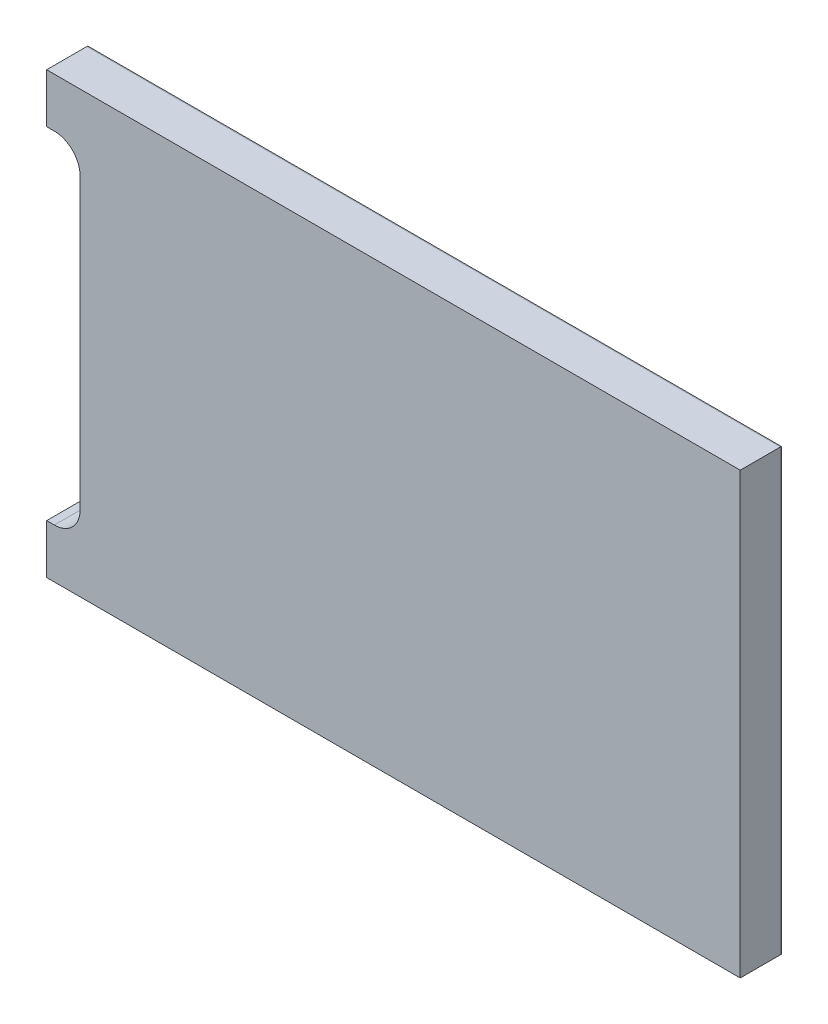
ISO-10303-21;
HEADER;
FILE_DESCRIPTION(('STEP AP214'),'2;1');
FILE_NAME('part.step','',(''),(''),'','','');
FILE_SCHEMA(('AUTOMOTIVE_DESIGN { 1 0 10303 214 1 1 1 1 }'));
ENDSEC;
DATA;
#1=APPLICATION_CONTEXT('core data for automotive mechanical design processes');
#2=APPLICATION_PROTOCOL_DEFINITION('international standard','automotive_design',2000,#1);
#3=PRODUCT_CONTEXT('',#1,'mechanical');
#4=PRODUCT('Part','Part','',(#3));
#5=PRODUCT_RELATED_PRODUCT_CATEGORY('part','',(#4));
#6=PRODUCT_DEFINITION_FORMATION('','',#4);
#7=PRODUCT_DEFINITION_CONTEXT('part definition',#1,'design');
#8=PRODUCT_DEFINITION('design','',#6,#7);
#9=PRODUCT_DEFINITION_SHAPE('','',#8);
#10=(LENGTH_UNIT() NAMED_UNIT(*) SI_UNIT(.MILLI.,.METRE.));
#11=(NAMED_UNIT(*) PLANE_ANGLE_UNIT() SI_UNIT($,.RADIAN.));
#12=(NAMED_UNIT(*) SI_UNIT($,.STERADIAN.) SOLID_ANGLE_UNIT());
#13=UNCERTAINTY_MEASURE_WITH_UNIT(LENGTH_MEASURE(1.E-05),#10,'distance_accuracy_value','');
#14=(GEOMETRIC_REPRESENTATION_CONTEXT(3) GLOBAL_UNCERTAINTY_ASSIGNED_CONTEXT((#13)) GLOBAL_UNIT_ASSIGNED_CONTEXT((#10,
#11,#12)) REPRESENTATION_CONTEXT('',''));
#15=CARTESIAN_POINT('',(0.,0.,0.));
#16=DIRECTION('',(0.,0.,1.));
#17=DIRECTION('',(1.,0.,0.));
#18=AXIS2_PLACEMENT_3D('',#15,#16,#17);
#19=CARTESIAN_POINT('',(0.,0.,-0.0699999999999998));
#20=DIRECTION('',(1.,0.,0.));
#21=DIRECTION('',(0.,0.,1.));
#22=AXIS2_PLACEMENT_3D('',#19,#20,#21);
#23=PLANE('',#22);
#24=DIRECTION('',(0.,-1.,0.));
#25=VECTOR('',#24,1.);
#26=CARTESIAN_POINT('',(0.,17.1204473206109,-0.0349999999999999));
#27=LINE('',#26,#25);
#28=CARTESIAN_POINT('',(0.,1.92044732061088,-0.0349999999999999));
#29=VERTEX_POINT('',#28);
#30=CARTESIAN_POINT('',(0.,0.,-0.0349999999999999));
#31=VERTEX_POINT('',#30);
#32=EDGE_CURVE('E186',#29,#31,#27,.T.);
#33=ORIENTED_EDGE('',*,*,#32,.T.);
#34=DIRECTION('',(0.,0.,1.));
#35=VECTOR('',#34,1.);
#36=CARTESIAN_POINT('',(0.,0.,-0.0349999999999999));
#37=LINE('',#36,#35);
#38=CARTESIAN_POINT('',(0.,0.,0.));
#39=VERTEX_POINT('',#38);
#40=EDGE_CURVE('E188',#31,#39,#37,.T.);
#41=ORIENTED_EDGE('',*,*,#40,.T.);
#42=DIRECTION('',(0.,1.,0.));
#43=VECTOR('',#42,1.);
#44=CARTESIAN_POINT('',(0.,0.,0.));
#45=LINE('',#44,#43);
#46=CARTESIAN_POINT('',(0.,1.92044732061088,0.));
#47=VERTEX_POINT('',#46);
#48=EDGE_CURVE('E191',#39,#47,#45,.T.);
#49=ORIENTED_EDGE('',*,*,#48,.T.);
#50=DIRECTION('',(0.,0.,1.));
#51=VECTOR('',#50,1.);
#52=CARTESIAN_POINT('',(0.,1.92044732061088,-0.0699999999999998));
#53=LINE('',#52,#51);
#54=EDGE_CURVE('E12',#29,#47,#53,.T.);
#55=ORIENTED_EDGE('',*,*,#54,.F.);
#56=EDGE_LOOP('',(#33,#41,#49,#55));
#57=FACE_BOUND('',#56,.T.);
#58=ADVANCED_FACE('F51',(#57),#23,.F.);
#59=CARTESIAN_POINT('',(0.,17.1204473206109,0.));
#60=DIRECTION('',(0.,1.,0.));
#61=DIRECTION('',(0.,0.,-1.));
#62=AXIS2_PLACEMENT_3D('',#59,#60,#61);
#63=PLANE('',#62);
#64=DIRECTION('',(0.,0.,-1.));
#65=VECTOR('',#64,1.);
#66=CARTESIAN_POINT('',(27.,17.1204473206109,0.));
#67=LINE('',#66,#65);
#68=CARTESIAN_POINT('',(27.,17.1204473206109,0.));
#69=VERTEX_POINT('',#68);
#70=CARTESIAN_POINT('',(27.,17.1204473206109,-0.0349999999999999));
#71=VERTEX_POINT('',#70);
#72=EDGE_CURVE('E183',#69,#71,#67,.T.);
#73=ORIENTED_EDGE('',*,*,#72,.T.);
#74=DIRECTION('',(1.,0.,0.));
#75=VECTOR('',#74,1.);
#76=CARTESIAN_POINT('',(0.,17.1204473206109,-0.0349999999999999));
#77=LINE('',#76,#75);
#78=CARTESIAN_POINT('',(0.,17.1204473206109,-0.0349999999999999));
#79=VERTEX_POINT('',#78);
#80=EDGE_CURVE('E194',#79,#71,#77,.T.);
#81=ORIENTED_EDGE('',*,*,#80,.F.);
#82=DIRECTION('',(0.,0.,-1.));
#83=VECTOR('',#82,1.);
#84=CARTESIAN_POINT('',(0.,17.1204473206109,0.));
#85=LINE('',#84,#83);
#86=CARTESIAN_POINT('',(0.,17.1204473206109,0.));
#87=VERTEX_POINT('',#86);
#88=EDGE_CURVE('E184',#87,#79,#85,.T.);
#89=ORIENTED_EDGE('',*,*,#88,.F.);
#90=DIRECTION('',(1.,0.,0.));
#91=VECTOR('',#90,1.);
#92=CARTESIAN_POINT('',(0.,17.1204473206109,0.));
#93=LINE('',#92,#91);
#94=EDGE_CURVE('E202',#87,#69,#93,.T.);
#95=ORIENTED_EDGE('',*,*,#94,.T.);
#96=EDGE_LOOP('',(#73,#81,#89,#95));
#97=FACE_BOUND('',#96,.T.);
#98=ADVANCED_FACE('F53',(#97),#63,.T.);
#99=CARTESIAN_POINT('',(0.,0.,0.));
#100=DIRECTION('',(0.,0.,1.));
#101=DIRECTION('',(-1.,0.,0.));
#102=AXIS2_PLACEMENT_3D('',#99,#100,#101);
#103=PLANE('',#102);
#104=DIRECTION('',(-1.,0.,0.));
#105=VECTOR('',#104,1.);
#106=CARTESIAN_POINT('',(0.,1.92044732061088,0.));
#107=LINE('',#106,#105);
#108=CARTESIAN_POINT('',(0.3,1.92044732061088,0.));
#109=VERTEX_POINT('',#108);
#110=EDGE_CURVE('E175',#109,#47,#107,.T.);
#111=ORIENTED_EDGE('',*,*,#110,.T.);
#112=ORIENTED_EDGE('',*,*,#48,.F.);
#113=DIRECTION('',(1.,0.,0.));
#114=VECTOR('',#113,1.);
#115=CARTESIAN_POINT('',(0.,0.,0.));
#116=LINE('',#115,#114);
#117=CARTESIAN_POINT('',(27.,0.,0.));
#118=VERTEX_POINT('',#117);
#119=EDGE_CURVE('E204',#39,#118,#116,.T.);
#120=ORIENTED_EDGE('',*,*,#119,.T.);
#121=DIRECTION('',(0.,1.,0.));
#122=VECTOR('',#121,1.);
#123=CARTESIAN_POINT('',(27.,0.,0.));
#124=LINE('',#123,#122);
#125=EDGE_CURVE('E95',#118,#69,#124,.T.);
#126=ORIENTED_EDGE('',*,*,#125,.T.);
#127=ORIENTED_EDGE('',*,*,#94,.F.);
#128=CARTESIAN_POINT('',(0.,15.2,0.));
#129=VERTEX_POINT('',#128);
#130=EDGE_CURVE('E73',#129,#87,#45,.T.);
#131=ORIENTED_EDGE('',*,*,#130,.F.);
#132=DIRECTION('',(1.,0.,0.));
#133=VECTOR('',#132,1.);
#134=CARTESIAN_POINT('',(0.,15.2,0.));
#135=LINE('',#134,#133);
#136=CARTESIAN_POINT('',(0.3,15.2,0.));
#137=VERTEX_POINT('',#136);
#138=EDGE_CURVE('E169',#129,#137,#135,.T.);
#139=ORIENTED_EDGE('',*,*,#138,.T.);
#140=CARTESIAN_POINT('',(0.3,14.2,0.));
#141=DIRECTION('',(0.,0.,-1.));
#142=DIRECTION('',(-1.,0.,0.));
#143=AXIS2_PLACEMENT_3D('',#140,#141,#142);
#144=CIRCLE('',#143,1.);
#145=CARTESIAN_POINT('',(1.3,14.2,0.));
#146=VERTEX_POINT('',#145);
#147=EDGE_CURVE('E179',#137,#146,#144,.T.);
#148=ORIENTED_EDGE('',*,*,#147,.T.);
#149=DIRECTION('',(0.,-1.,0.));
#150=VECTOR('',#149,1.);
#151=CARTESIAN_POINT('',(1.3,0.,0.));
#152=LINE('',#151,#150);
#153=CARTESIAN_POINT('',(1.3,2.92044732061088,0.));
#154=VERTEX_POINT('',#153);
#155=EDGE_CURVE('E177',#146,#154,#152,.T.);
#156=ORIENTED_EDGE('',*,*,#155,.T.);
#157=CARTESIAN_POINT('',(0.3,2.92044732061088,0.));
#158=DIRECTION('',(0.,0.,-1.));
#159=DIRECTION('',(-1.,0.,0.));
#160=AXIS2_PLACEMENT_3D('',#157,#158,#159);
#161=CIRCLE('',#160,1.);
#162=EDGE_CURVE('E145',#154,#109,#161,.T.);
#163=ORIENTED_EDGE('',*,*,#162,.T.);
#164=EDGE_LOOP('',(#111,#112,#120,#126,#127,#131,#139,#148,#156,#163));
#165=FACE_BOUND('',#164,.T.);
#166=ADVANCED_FACE('F226',(#165),#103,.T.);
#167=CARTESIAN_POINT('',(0.,0.,-0.0349999999999999));
#168=DIRECTION('',(0.,-1.,0.));
#169=DIRECTION('',(0.,0.,1.));
#170=AXIS2_PLACEMENT_3D('',#167,#168,#169);
#171=PLANE('',#170);
#172=DIRECTION('',(0.,0.,1.));
#173=VECTOR('',#172,1.);
#174=CARTESIAN_POINT('',(27.,0.,-0.0349999999999999));
#175=LINE('',#174,#173);
#176=CARTESIAN_POINT('',(27.,0.,-0.0349999999999999));
#177=VERTEX_POINT('',#176);
#178=EDGE_CURVE('E199',#177,#118,#175,.T.);
#179=ORIENTED_EDGE('',*,*,#178,.T.);
#180=ORIENTED_EDGE('',*,*,#119,.F.);
#181=ORIENTED_EDGE('',*,*,#40,.F.);
#182=DIRECTION('',(1.,0.,0.));
#183=VECTOR('',#182,1.);
#184=CARTESIAN_POINT('',(0.,0.,-0.0349999999999999));
#185=LINE('',#184,#183);
#186=EDGE_CURVE('E206',#31,#177,#185,.T.);
#187=ORIENTED_EDGE('',*,*,#186,.T.);
#188=EDGE_LOOP('',(#179,#180,#181,#187));
#189=FACE_BOUND('',#188,.T.);
#190=ADVANCED_FACE('F217',(#189),#171,.T.);
#191=CARTESIAN_POINT('',(0.,17.1204473206109,-0.0349999999999999));
#192=DIRECTION('',(0.,0.,-1.));
#193=DIRECTION('',(1.,0.,0.));
#194=AXIS2_PLACEMENT_3D('',#191,#192,#193);
#195=PLANE('',#194);
#196=DIRECTION('',(1.,0.,0.));
#197=VECTOR('',#196,1.);
#198=CARTESIAN_POINT('',(0.,1.92044732061088,-0.0349999999999999));
#199=LINE('',#198,#197);
#200=CARTESIAN_POINT('',(0.3,1.92044732061088,-0.0349999999999999));
#201=VERTEX_POINT('',#200);
#202=EDGE_CURVE('E150',#29,#201,#199,.T.);
#203=ORIENTED_EDGE('',*,*,#202,.T.);
#204=CARTESIAN_POINT('',(0.3,2.92044732061088,-0.0349999999999999));
#205=DIRECTION('',(0.,0.,1.));
#206=DIRECTION('',(-1.,0.,0.));
#207=AXIS2_PLACEMENT_3D('',#204,#205,#206);
#208=CIRCLE('',#207,1.);
#209=CARTESIAN_POINT('',(1.3,2.92044732061088,-0.0349999999999999));
#210=VERTEX_POINT('',#209);
#211=EDGE_CURVE('E142',#201,#210,#208,.T.);
#212=ORIENTED_EDGE('',*,*,#211,.T.);
#213=DIRECTION('',(0.,1.,0.));
#214=VECTOR('',#213,1.);
#215=CARTESIAN_POINT('',(1.3,2.92044732061088,-0.0349999999999999));
#216=LINE('',#215,#214);
#217=CARTESIAN_POINT('',(1.3,14.2,-0.0349999999999999));
#218=VERTEX_POINT('',#217);
#219=EDGE_CURVE('E153',#210,#218,#216,.T.);
#220=ORIENTED_EDGE('',*,*,#219,.T.);
#221=CARTESIAN_POINT('',(0.3,14.2,-0.0349999999999999));
#222=DIRECTION('',(0.,0.,1.));
#223=DIRECTION('',(1.,0.,0.));
#224=AXIS2_PLACEMENT_3D('',#221,#222,#223);
#225=CIRCLE('',#224,1.);
#226=CARTESIAN_POINT('',(0.3,15.2,-0.0349999999999999));
#227=VERTEX_POINT('',#226);
#228=EDGE_CURVE('E157',#218,#227,#225,.T.);
#229=ORIENTED_EDGE('',*,*,#228,.T.);
#230=DIRECTION('',(-1.,0.,0.));
#231=VECTOR('',#230,1.);
#232=CARTESIAN_POINT('',(0.,15.2,-0.0349999999999999));
#233=LINE('',#232,#231);
#234=CARTESIAN_POINT('',(0.,15.2,-0.0349999999999999));
#235=VERTEX_POINT('',#234);
#236=EDGE_CURVE('E164',#227,#235,#233,.T.);
#237=ORIENTED_EDGE('',*,*,#236,.T.);
#238=EDGE_CURVE('E102',#79,#235,#27,.T.);
#239=ORIENTED_EDGE('',*,*,#238,.F.);
#240=ORIENTED_EDGE('',*,*,#80,.T.);
#241=DIRECTION('',(0.,-1.,0.));
#242=VECTOR('',#241,1.);
#243=CARTESIAN_POINT('',(27.,17.1204473206109,-0.0349999999999999));
#244=LINE('',#243,#242);
#245=EDGE_CURVE('E197',#71,#177,#244,.T.);
#246=ORIENTED_EDGE('',*,*,#245,.T.);
#247=ORIENTED_EDGE('',*,*,#186,.F.);
#248=ORIENTED_EDGE('',*,*,#32,.F.);
#249=EDGE_LOOP('',(#203,#212,#220,#229,#237,#239,#240,#246,#247,#248));
#250=FACE_BOUND('',#249,.T.);
#251=ADVANCED_FACE('F159',(#250),#195,.T.);
#252=ORIENTED_EDGE('',*,*,#130,.T.);
#253=ORIENTED_EDGE('',*,*,#88,.T.);
#254=ORIENTED_EDGE('',*,*,#238,.T.);
#255=DIRECTION('',(0.,0.,-1.));
#256=VECTOR('',#255,1.);
#257=CARTESIAN_POINT('',(0.,15.2,-0.0699999999999998));
#258=LINE('',#257,#256);
#259=EDGE_CURVE('E59',#129,#235,#258,.T.);
#260=ORIENTED_EDGE('',*,*,#259,.F.);
#261=EDGE_LOOP('',(#252,#253,#254,#260));
#262=FACE_BOUND('',#261,.T.);
#263=ADVANCED_FACE('F231',(#262),#23,.F.);
#264=CARTESIAN_POINT('',(27.,0.,-0.0699999999999998));
#265=DIRECTION('',(1.,0.,0.));
#266=DIRECTION('',(0.,0.,1.));
#267=AXIS2_PLACEMENT_3D('',#264,#265,#266);
#268=PLANE('',#267);
#269=ORIENTED_EDGE('',*,*,#72,.F.);
#270=ORIENTED_EDGE('',*,*,#125,.F.);
#271=ORIENTED_EDGE('',*,*,#178,.F.);
#272=ORIENTED_EDGE('',*,*,#245,.F.);
#273=EDGE_LOOP('',(#269,#270,#271,#272));
#274=FACE_BOUND('',#273,.T.);
#275=ADVANCED_FACE('F214',(#274),#268,.T.);
#276=CARTESIAN_POINT('',(0.3,2.92044732061088,26.965));
#277=DIRECTION('',(0.,0.,-1.));
#278=DIRECTION('',(1.,0.,0.));
#279=AXIS2_PLACEMENT_3D('',#276,#277,#278);
#280=CYLINDRICAL_SURFACE('',#279,1.);
#281=ORIENTED_EDGE('',*,*,#162,.F.);
#282=DIRECTION('',(0.,0.,-1.));
#283=VECTOR('',#282,1.);
#284=CARTESIAN_POINT('',(1.3,2.92044732061088,26.965));
#285=LINE('',#284,#283);
#286=EDGE_CURVE('E138',#154,#210,#285,.T.);
#287=ORIENTED_EDGE('',*,*,#286,.T.);
#288=ORIENTED_EDGE('',*,*,#211,.F.);
#289=DIRECTION('',(0.,0.,-1.));
#290=VECTOR('',#289,1.);
#291=CARTESIAN_POINT('',(0.3,1.92044732061088,26.965));
#292=LINE('',#291,#290);
#293=EDGE_CURVE('E167',#109,#201,#292,.T.);
#294=ORIENTED_EDGE('',*,*,#293,.F.);
#295=EDGE_LOOP('',(#281,#287,#288,#294));
#296=FACE_BOUND('',#295,.T.);
#297=ADVANCED_FACE('F140',(#296),#280,.F.);
#298=CARTESIAN_POINT('',(0.,1.92044732061088,26.965));
#299=DIRECTION('',(0.,-1.,0.));
#300=DIRECTION('',(0.,0.,1.));
#301=AXIS2_PLACEMENT_3D('',#298,#299,#300);
#302=PLANE('',#301);
#303=ORIENTED_EDGE('',*,*,#110,.F.);
#304=ORIENTED_EDGE('',*,*,#293,.T.);
#305=ORIENTED_EDGE('',*,*,#202,.F.);
#306=ORIENTED_EDGE('',*,*,#54,.T.);
#307=EDGE_LOOP('',(#303,#304,#305,#306));
#308=FACE_BOUND('',#307,.T.);
#309=ADVANCED_FACE('F225',(#308),#302,.F.);
#310=CARTESIAN_POINT('',(0.,15.2,26.965));
#311=DIRECTION('',(0.,1.,0.));
#312=DIRECTION('',(0.,0.,-1.));
#313=AXIS2_PLACEMENT_3D('',#310,#311,#312);
#314=PLANE('',#313);
#315=ORIENTED_EDGE('',*,*,#138,.F.);
#316=ORIENTED_EDGE('',*,*,#259,.T.);
#317=ORIENTED_EDGE('',*,*,#236,.F.);
#318=DIRECTION('',(0.,0.,-1.));
#319=VECTOR('',#318,1.);
#320=CARTESIAN_POINT('',(0.3,15.2,26.965));
#321=LINE('',#320,#319);
#322=EDGE_CURVE('E170',#137,#227,#321,.T.);
#323=ORIENTED_EDGE('',*,*,#322,.F.);
#324=EDGE_LOOP('',(#315,#316,#317,#323));
#325=FACE_BOUND('',#324,.T.);
#326=ADVANCED_FACE('F230',(#325),#314,.F.);
#327=CARTESIAN_POINT('',(0.3,14.2,26.965));
#328=DIRECTION('',(0.,0.,-1.));
#329=DIRECTION('',(1.,0.,0.));
#330=AXIS2_PLACEMENT_3D('',#327,#328,#329);
#331=CYLINDRICAL_SURFACE('',#330,1.);
#332=ORIENTED_EDGE('',*,*,#147,.F.);
#333=ORIENTED_EDGE('',*,*,#322,.T.);
#334=ORIENTED_EDGE('',*,*,#228,.F.);
#335=DIRECTION('',(0.,0.,-1.));
#336=VECTOR('',#335,1.);
#337=CARTESIAN_POINT('',(1.3,14.2,26.965));
#338=LINE('',#337,#336);
#339=EDGE_CURVE('E149',#146,#218,#338,.T.);
#340=ORIENTED_EDGE('',*,*,#339,.F.);
#341=EDGE_LOOP('',(#332,#333,#334,#340));
#342=FACE_BOUND('',#341,.T.);
#343=ADVANCED_FACE('F229',(#342),#331,.F.);
#344=CARTESIAN_POINT('',(1.3,2.92044732061088,26.965));
#345=DIRECTION('',(1.,0.,0.));
#346=DIRECTION('',(0.,1.,0.));
#347=AXIS2_PLACEMENT_3D('',#344,#345,#346);
#348=PLANE('',#347);
#349=ORIENTED_EDGE('',*,*,#155,.F.);
#350=ORIENTED_EDGE('',*,*,#339,.T.);
#351=ORIENTED_EDGE('',*,*,#219,.F.);
#352=ORIENTED_EDGE('',*,*,#286,.F.);
#353=EDGE_LOOP('',(#349,#350,#351,#352));
#354=FACE_BOUND('',#353,.T.);
#355=ADVANCED_FACE('F154',(#354),#348,.F.);
#356=CLOSED_SHELL('',(#58,#98,#166,#190,#251,#263,#275,#297,#309,#326,#343,#355));
#357=MANIFOLD_SOLID_BREP('B2',#356);
#358=CARTESIAN_POINT('',(0.3,2.92044732061088,1.565));
#359=DIRECTION('',(0.,0.,-1.));
#360=DIRECTION('',(-1.,0.,0.));
#361=AXIS2_PLACEMENT_3D('',#358,#359,#360);
#362=CYLINDRICAL_SURFACE('',#361,1.);
#363=DIRECTION('',(0.,0.,1.));
#364=VECTOR('',#363,1.);
#365=CARTESIAN_POINT('',(1.3,2.92044732061088,1.565));
#366=LINE('',#365,#364);
#367=CARTESIAN_POINT('',(1.3,2.92044732061088,0.));
#368=VERTEX_POINT('',#367);
#369=CARTESIAN_POINT('',(1.3,2.92044732061088,1.565));
#370=VERTEX_POINT('',#369);
#371=EDGE_CURVE('E486',#368,#370,#366,.T.);
#372=ORIENTED_EDGE('',*,*,#371,.F.);
#373=CARTESIAN_POINT('',(0.3,2.92044732061088,0.));
#374=DIRECTION('',(0.,0.,1.));
#375=DIRECTION('',(1.,0.,0.));
#376=AXIS2_PLACEMENT_3D('',#373,#374,#375);
#377=CIRCLE('',#376,1.);
#378=CARTESIAN_POINT('',(0.3,1.92044732061088,0.));
#379=VERTEX_POINT('',#378);
#380=EDGE_CURVE('E373',#368,#379,#377,.F.);
#381=ORIENTED_EDGE('',*,*,#380,.T.);
#382=DIRECTION('',(0.,0.,1.));
#383=VECTOR('',#382,1.);
#384=CARTESIAN_POINT('',(0.3,1.92044732061088,1.565));
#385=LINE('',#384,#383);
#386=CARTESIAN_POINT('',(0.3,1.92044732061088,1.565));
#387=VERTEX_POINT('',#386);
#388=EDGE_CURVE('E490',#387,#379,#385,.F.);
#389=ORIENTED_EDGE('',*,*,#388,.F.);
#390=CARTESIAN_POINT('',(0.3,2.92044732061088,1.565));
#391=DIRECTION('',(0.,0.,1.));
#392=DIRECTION('',(1.,0.,0.));
#393=AXIS2_PLACEMENT_3D('',#390,#391,#392);
#394=CIRCLE('',#393,1.);
#395=EDGE_CURVE('E49',#387,#370,#394,.T.);
#396=ORIENTED_EDGE('',*,*,#395,.T.);
#397=EDGE_LOOP('',(#372,#381,#389,#396));
#398=FACE_BOUND('',#397,.T.);
#399=ADVANCED_FACE('F365',(#398),#362,.F.);
#400=CARTESIAN_POINT('',(0.3,14.2,1.565));
#401=DIRECTION('',(0.,0.,-1.));
#402=DIRECTION('',(-1.,0.,0.));
#403=AXIS2_PLACEMENT_3D('',#400,#401,#402);
#404=CYLINDRICAL_SURFACE('',#403,1.);
#405=DIRECTION('',(0.,0.,1.));
#406=VECTOR('',#405,1.);
#407=CARTESIAN_POINT('',(0.3,15.2,1.565));
#408=LINE('',#407,#406);
#409=CARTESIAN_POINT('',(0.3,15.2,0.));
#410=VERTEX_POINT('',#409);
#411=CARTESIAN_POINT('',(0.3,15.2,1.565));
#412=VERTEX_POINT('',#411);
#413=EDGE_CURVE('E466',#410,#412,#408,.T.);
#414=ORIENTED_EDGE('',*,*,#413,.F.);
#415=CARTESIAN_POINT('',(0.3,14.2,0.));
#416=DIRECTION('',(0.,0.,1.));
#417=DIRECTION('',(1.,0.,0.));
#418=AXIS2_PLACEMENT_3D('',#415,#416,#417);
#419=CIRCLE('',#418,1.);
#420=CARTESIAN_POINT('',(1.3,14.2,0.));
#421=VERTEX_POINT('',#420);
#422=EDGE_CURVE('E480',#410,#421,#419,.F.);
#423=ORIENTED_EDGE('',*,*,#422,.T.);
#424=DIRECTION('',(0.,0.,1.));
#425=VECTOR('',#424,1.);
#426=CARTESIAN_POINT('',(1.3,14.2,1.565));
#427=LINE('',#426,#425);
#428=CARTESIAN_POINT('',(1.3,14.2,1.565));
#429=VERTEX_POINT('',#428);
#430=EDGE_CURVE('E471',#429,#421,#427,.F.);
#431=ORIENTED_EDGE('',*,*,#430,.F.);
#432=CARTESIAN_POINT('',(0.3,14.2,1.565));
#433=DIRECTION('',(0.,0.,1.));
#434=DIRECTION('',(1.,0.,0.));
#435=AXIS2_PLACEMENT_3D('',#432,#433,#434);
#436=CIRCLE('',#435,1.);
#437=EDGE_CURVE('E483',#429,#412,#436,.T.);
#438=ORIENTED_EDGE('',*,*,#437,.T.);
#439=EDGE_LOOP('',(#414,#423,#431,#438));
#440=FACE_BOUND('',#439,.T.);
#441=ADVANCED_FACE('F552',(#440),#404,.F.);
#442=CARTESIAN_POINT('',(0.,1.92044732061088,1.565));
#443=DIRECTION('',(1.,0.,0.));
#444=DIRECTION('',(0.,1.,0.));
#445=AXIS2_PLACEMENT_3D('',#442,#443,#444);
#446=PLANE('',#445);
#447=DIRECTION('',(0.,-1.,0.));
#448=VECTOR('',#447,1.);
#449=CARTESIAN_POINT('',(0.,1.92044732061088,0.));
#450=LINE('',#449,#448);
#451=CARTESIAN_POINT('',(0.,1.92044732061088,0.));
#452=VERTEX_POINT('',#451);
#453=CARTESIAN_POINT('',(0.,0.,0.));
#454=VERTEX_POINT('',#453);
#455=EDGE_CURVE('E464',#452,#454,#450,.T.);
#456=ORIENTED_EDGE('',*,*,#455,.T.);
#457=DIRECTION('',(0.,0.,-1.));
#458=VECTOR('',#457,1.);
#459=CARTESIAN_POINT('',(0.,0.,1.565));
#460=LINE('',#459,#458);
#461=CARTESIAN_POINT('',(0.,0.,1.565));
#462=VERTEX_POINT('',#461);
#463=EDGE_CURVE('E443',#462,#454,#460,.T.);
#464=ORIENTED_EDGE('',*,*,#463,.F.);
#465=DIRECTION('',(0.,-1.,0.));
#466=VECTOR('',#465,1.);
#467=CARTESIAN_POINT('',(0.,1.92044732061088,1.565));
#468=LINE('',#467,#466);
#469=CARTESIAN_POINT('',(0.,1.92044732061088,1.565));
#470=VERTEX_POINT('',#469);
#471=EDGE_CURVE('E450',#470,#462,#468,.T.);
#472=ORIENTED_EDGE('',*,*,#471,.F.);
#473=DIRECTION('',(0.,0.,-1.));
#474=VECTOR('',#473,1.);
#475=CARTESIAN_POINT('',(0.,1.92044732061088,1.565));
#476=LINE('',#475,#474);
#477=EDGE_CURVE('E508',#470,#452,#476,.T.);
#478=ORIENTED_EDGE('',*,*,#477,.T.);
#479=EDGE_LOOP('',(#456,#464,#472,#478));
#480=FACE_BOUND('',#479,.T.);
#481=ADVANCED_FACE('F462',(#480),#446,.F.);
#482=CARTESIAN_POINT('',(0.,0.,1.565));
#483=DIRECTION('',(0.,1.,0.));
#484=DIRECTION('',(0.,0.,1.));
#485=AXIS2_PLACEMENT_3D('',#482,#483,#484);
#486=PLANE('',#485);
#487=DIRECTION('',(1.,0.,0.));
#488=VECTOR('',#487,1.);
#489=CARTESIAN_POINT('',(0.,0.,0.));
#490=LINE('',#489,#488);
#491=CARTESIAN_POINT('',(27.,0.,0.));
#492=VERTEX_POINT('',#491);
#493=EDGE_CURVE('E539',#454,#492,#490,.T.);
#494=ORIENTED_EDGE('',*,*,#493,.T.);
#495=DIRECTION('',(0.,0.,-1.));
#496=VECTOR('',#495,1.);
#497=CARTESIAN_POINT('',(27.,0.,1.565));
#498=LINE('',#497,#496);
#499=CARTESIAN_POINT('',(27.,0.,1.565));
#500=VERTEX_POINT('',#499);
#501=EDGE_CURVE('E446',#500,#492,#498,.T.);
#502=ORIENTED_EDGE('',*,*,#501,.F.);
#503=DIRECTION('',(1.,0.,0.));
#504=VECTOR('',#503,1.);
#505=CARTESIAN_POINT('',(0.,0.,1.565));
#506=LINE('',#505,#504);
#507=EDGE_CURVE('E439',#462,#500,#506,.T.);
#508=ORIENTED_EDGE('',*,*,#507,.F.);
#509=ORIENTED_EDGE('',*,*,#463,.T.);
#510=EDGE_LOOP('',(#494,#502,#508,#509));
#511=FACE_BOUND('',#510,.T.);
#512=ADVANCED_FACE('F441',(#511),#486,.F.);
#513=CARTESIAN_POINT('',(27.,0.,1.565));
#514=DIRECTION('',(-1.,0.,0.));
#515=DIRECTION('',(0.,0.,1.));
#516=AXIS2_PLACEMENT_3D('',#513,#514,#515);
#517=PLANE('',#516);
#518=DIRECTION('',(0.,1.,0.));
#519=VECTOR('',#518,1.);
#520=CARTESIAN_POINT('',(27.,0.,0.));
#521=LINE('',#520,#519);
#522=CARTESIAN_POINT('',(27.,17.1204473206109,0.));
#523=VERTEX_POINT('',#522);
#524=EDGE_CURVE('E531',#492,#523,#521,.T.);
#525=ORIENTED_EDGE('',*,*,#524,.T.);
#526=DIRECTION('',(0.,0.,-1.));
#527=VECTOR('',#526,1.);
#528=CARTESIAN_POINT('',(27.,17.1204473206109,1.565));
#529=LINE('',#528,#527);
#530=CARTESIAN_POINT('',(27.,17.1204473206109,1.565));
#531=VERTEX_POINT('',#530);
#532=EDGE_CURVE('E473',#531,#523,#529,.T.);
#533=ORIENTED_EDGE('',*,*,#532,.F.);
#534=DIRECTION('',(0.,1.,0.));
#535=VECTOR('',#534,1.);
#536=CARTESIAN_POINT('',(27.,0.,1.565));
#537=LINE('',#536,#535);
#538=EDGE_CURVE('E449',#500,#531,#537,.T.);
#539=ORIENTED_EDGE('',*,*,#538,.F.);
#540=ORIENTED_EDGE('',*,*,#501,.T.);
#541=EDGE_LOOP('',(#525,#533,#539,#540));
#542=FACE_BOUND('',#541,.T.);
#543=ADVANCED_FACE('F570',(#542),#517,.F.);
#544=CARTESIAN_POINT('',(27.,17.1204473206109,1.565));
#545=DIRECTION('',(0.,-1.,0.));
#546=DIRECTION('',(1.,0.,0.));
#547=AXIS2_PLACEMENT_3D('',#544,#545,#546);
#548=PLANE('',#547);
#549=DIRECTION('',(-1.,0.,0.));
#550=VECTOR('',#549,1.);
#551=CARTESIAN_POINT('',(27.,17.1204473206109,0.));
#552=LINE('',#551,#550);
#553=CARTESIAN_POINT('',(0.,17.1204473206109,0.));
#554=VERTEX_POINT('',#553);
#555=EDGE_CURVE('E526',#523,#554,#552,.T.);
#556=ORIENTED_EDGE('',*,*,#555,.T.);
#557=DIRECTION('',(0.,0.,-1.));
#558=VECTOR('',#557,1.);
#559=CARTESIAN_POINT('',(0.,17.1204473206109,1.565));
#560=LINE('',#559,#558);
#561=CARTESIAN_POINT('',(0.,17.1204473206109,1.565));
#562=VERTEX_POINT('',#561);
#563=EDGE_CURVE('E515',#562,#554,#560,.T.);
#564=ORIENTED_EDGE('',*,*,#563,.F.);
#565=DIRECTION('',(-1.,0.,0.));
#566=VECTOR('',#565,1.);
#567=CARTESIAN_POINT('',(27.,17.1204473206109,1.565));
#568=LINE('',#567,#566);
#569=EDGE_CURVE('E527',#531,#562,#568,.T.);
#570=ORIENTED_EDGE('',*,*,#569,.F.);
#571=ORIENTED_EDGE('',*,*,#532,.T.);
#572=EDGE_LOOP('',(#556,#564,#570,#571));
#573=FACE_BOUND('',#572,.T.);
#574=ADVANCED_FACE('F524',(#573),#548,.F.);
#575=CARTESIAN_POINT('',(0.,17.1204473206109,1.565));
#576=DIRECTION('',(1.,0.,0.));
#577=DIRECTION('',(0.,1.,0.));
#578=AXIS2_PLACEMENT_3D('',#575,#576,#577);
#579=PLANE('',#578);
#580=DIRECTION('',(0.,-1.,0.));
#581=VECTOR('',#580,1.);
#582=CARTESIAN_POINT('',(0.,17.1204473206109,0.));
#583=LINE('',#582,#581);
#584=CARTESIAN_POINT('',(0.,15.2,0.));
#585=VERTEX_POINT('',#584);
#586=EDGE_CURVE('E533',#554,#585,#583,.T.);
#587=ORIENTED_EDGE('',*,*,#586,.T.);
#588=DIRECTION('',(0.,0.,-1.));
#589=VECTOR('',#588,1.);
#590=CARTESIAN_POINT('',(0.,15.2,1.565));
#591=LINE('',#590,#589);
#592=CARTESIAN_POINT('',(0.,15.2,1.565));
#593=VERTEX_POINT('',#592);
#594=EDGE_CURVE('E511',#593,#585,#591,.T.);
#595=ORIENTED_EDGE('',*,*,#594,.F.);
#596=DIRECTION('',(0.,-1.,0.));
#597=VECTOR('',#596,1.);
#598=CARTESIAN_POINT('',(0.,17.1204473206109,1.565));
#599=LINE('',#598,#597);
#600=EDGE_CURVE('E557',#562,#593,#599,.T.);
#601=ORIENTED_EDGE('',*,*,#600,.F.);
#602=ORIENTED_EDGE('',*,*,#563,.T.);
#603=EDGE_LOOP('',(#587,#595,#601,#602));
#604=FACE_BOUND('',#603,.T.);
#605=ADVANCED_FACE('F575',(#604),#579,.F.);
#606=CARTESIAN_POINT('',(0.,15.2,1.565));
#607=DIRECTION('',(0.,1.,0.));
#608=DIRECTION('',(0.,0.,1.));
#609=AXIS2_PLACEMENT_3D('',#606,#607,#608);
#610=PLANE('',#609);
#611=DIRECTION('',(1.,0.,0.));
#612=VECTOR('',#611,1.);
#613=CARTESIAN_POINT('',(0.,15.2,0.));
#614=LINE('',#613,#612);
#615=EDGE_CURVE('E504',#585,#410,#614,.T.);
#616=ORIENTED_EDGE('',*,*,#615,.T.);
#617=ORIENTED_EDGE('',*,*,#413,.T.);
#618=DIRECTION('',(1.,0.,0.));
#619=VECTOR('',#618,1.);
#620=CARTESIAN_POINT('',(0.,15.2,1.565));
#621=LINE('',#620,#619);
#622=EDGE_CURVE('E555',#593,#412,#621,.T.);
#623=ORIENTED_EDGE('',*,*,#622,.F.);
#624=ORIENTED_EDGE('',*,*,#594,.T.);
#625=EDGE_LOOP('',(#616,#617,#623,#624));
#626=FACE_BOUND('',#625,.T.);
#627=ADVANCED_FACE('F545',(#626),#610,.F.);
#628=CARTESIAN_POINT('',(1.3,15.2,1.565));
#629=DIRECTION('',(1.,0.,0.));
#630=DIRECTION('',(0.,0.,-1.));
#631=AXIS2_PLACEMENT_3D('',#628,#629,#630);
#632=PLANE('',#631);
#633=DIRECTION('',(0.,-1.,0.));
#634=VECTOR('',#633,1.);
#635=CARTESIAN_POINT('',(1.3,15.2,0.));
#636=LINE('',#635,#634);
#637=EDGE_CURVE('E500',#421,#368,#636,.T.);
#638=ORIENTED_EDGE('',*,*,#637,.T.);
#639=ORIENTED_EDGE('',*,*,#371,.T.);
#640=DIRECTION('',(0.,-1.,0.));
#641=VECTOR('',#640,1.);
#642=CARTESIAN_POINT('',(1.3,15.2,1.565));
#643=LINE('',#642,#641);
#644=EDGE_CURVE('E554',#429,#370,#643,.T.);
#645=ORIENTED_EDGE('',*,*,#644,.F.);
#646=ORIENTED_EDGE('',*,*,#430,.T.);
#647=EDGE_LOOP('',(#638,#639,#645,#646));
#648=FACE_BOUND('',#647,.T.);
#649=ADVANCED_FACE('F582',(#648),#632,.F.);
#650=CARTESIAN_POINT('',(0.,1.92044732061088,1.565));
#651=DIRECTION('',(0.,-1.,0.));
#652=DIRECTION('',(0.,0.,-1.));
#653=AXIS2_PLACEMENT_3D('',#650,#651,#652);
#654=PLANE('',#653);
#655=DIRECTION('',(-1.,0.,0.));
#656=VECTOR('',#655,1.);
#657=CARTESIAN_POINT('',(0.,1.92044732061088,1.565));
#658=LINE('',#657,#656);
#659=EDGE_CURVE('E455',#387,#470,#658,.T.);
#660=ORIENTED_EDGE('',*,*,#659,.F.);
#661=ORIENTED_EDGE('',*,*,#388,.T.);
#662=DIRECTION('',(-1.,0.,0.));
#663=VECTOR('',#662,1.);
#664=CARTESIAN_POINT('',(0.,1.92044732061088,0.));
#665=LINE('',#664,#663);
#666=EDGE_CURVE('E460',#379,#452,#665,.T.);
#667=ORIENTED_EDGE('',*,*,#666,.T.);
#668=ORIENTED_EDGE('',*,*,#477,.F.);
#669=EDGE_LOOP('',(#660,#661,#667,#668));
#670=FACE_BOUND('',#669,.T.);
#671=ADVANCED_FACE('F495',(#670),#654,.F.);
#672=CARTESIAN_POINT('',(0.,0.,1.565));
#673=DIRECTION('',(0.,0.,1.));
#674=DIRECTION('',(1.,0.,0.));
#675=AXIS2_PLACEMENT_3D('',#672,#673,#674);
#676=PLANE('',#675);
#677=ORIENTED_EDGE('',*,*,#395,.F.);
#678=ORIENTED_EDGE('',*,*,#659,.T.);
#679=ORIENTED_EDGE('',*,*,#471,.T.);
#680=ORIENTED_EDGE('',*,*,#507,.T.);
#681=ORIENTED_EDGE('',*,*,#538,.T.);
#682=ORIENTED_EDGE('',*,*,#569,.T.);
#683=ORIENTED_EDGE('',*,*,#600,.T.);
#684=ORIENTED_EDGE('',*,*,#622,.T.);
#685=ORIENTED_EDGE('',*,*,#437,.F.);
#686=ORIENTED_EDGE('',*,*,#644,.T.);
#687=EDGE_LOOP('',(#677,#678,#679,#680,#681,#682,#683,#684,#685,#686));
#688=FACE_BOUND('',#687,.T.);
#689=ADVANCED_FACE('F453',(#688),#676,.T.);
#690=CARTESIAN_POINT('',(0.,0.,0.));
#691=DIRECTION('',(0.,0.,1.));
#692=DIRECTION('',(1.,0.,0.));
#693=AXIS2_PLACEMENT_3D('',#690,#691,#692);
#694=PLANE('',#693);
#695=ORIENTED_EDGE('',*,*,#455,.F.);
#696=ORIENTED_EDGE('',*,*,#666,.F.);
#697=ORIENTED_EDGE('',*,*,#380,.F.);
#698=ORIENTED_EDGE('',*,*,#637,.F.);
#699=ORIENTED_EDGE('',*,*,#422,.F.);
#700=ORIENTED_EDGE('',*,*,#615,.F.);
#701=ORIENTED_EDGE('',*,*,#586,.F.);
#702=ORIENTED_EDGE('',*,*,#555,.F.);
#703=ORIENTED_EDGE('',*,*,#524,.F.);
#704=ORIENTED_EDGE('',*,*,#493,.F.);
#705=EDGE_LOOP('',(#695,#696,#697,#698,#699,#700,#701,#702,#703,#704));
#706=FACE_BOUND('',#705,.T.);
#707=ADVANCED_FACE('F497',(#706),#694,.F.);
#708=CLOSED_SHELL('',(#399,#441,#481,#512,#543,#574,#605,#627,#649,#671,#689,#707));
#709=MANIFOLD_SOLID_BREP('B6',#708);
#710=ADVANCED_BREP_SHAPE_REPRESENTATION('',(#18,#357,#709),#14);
#711=SHAPE_DEFINITION_REPRESENTATION(#9,#710);
ENDSEC;
END-ISO-10303-21;
